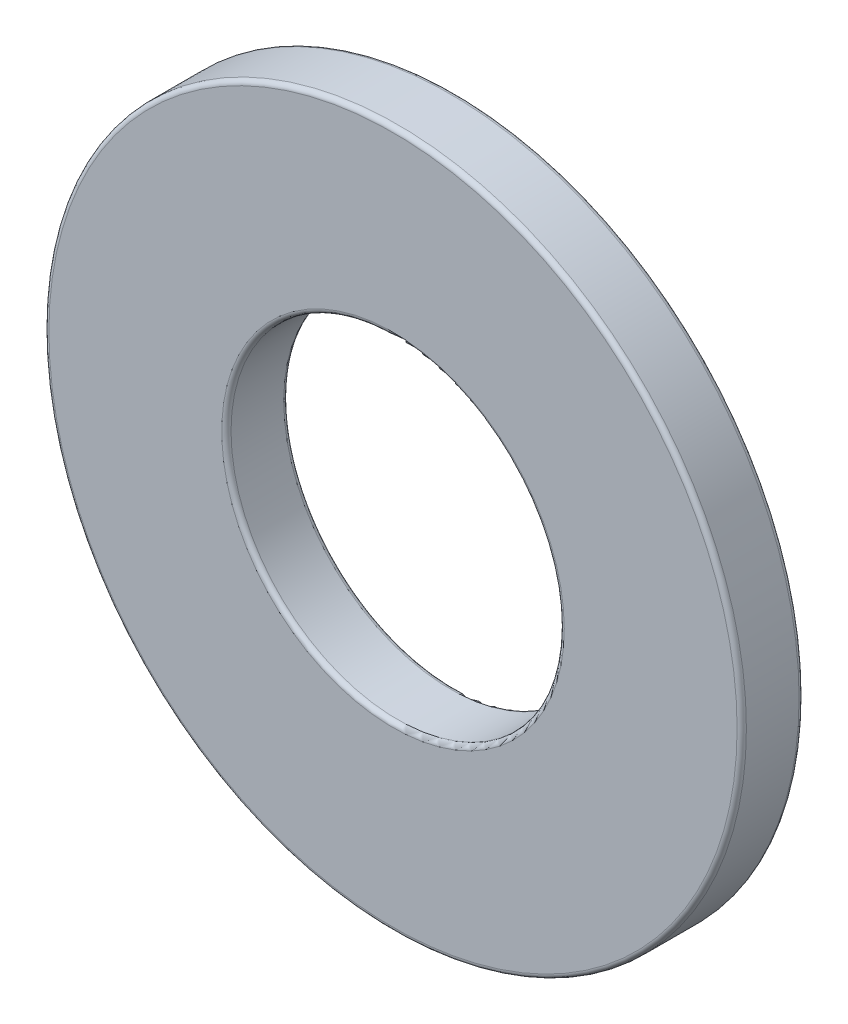
ISO-10303-21;
HEADER;
FILE_DESCRIPTION(('STEP AP214'),'2;1');
FILE_NAME('part.step','',(''),(''),'','','');
FILE_SCHEMA(('AUTOMOTIVE_DESIGN { 1 0 10303 214 1 1 1 1 }'));
ENDSEC;
DATA;
#1=APPLICATION_CONTEXT('core data for automotive mechanical design processes');
#2=APPLICATION_PROTOCOL_DEFINITION('international standard','automotive_design',2000,#1);
#3=PRODUCT_CONTEXT('',#1,'mechanical');
#4=PRODUCT('Part','Part','',(#3));
#5=PRODUCT_RELATED_PRODUCT_CATEGORY('part','',(#4));
#6=PRODUCT_DEFINITION_FORMATION('','',#4);
#7=PRODUCT_DEFINITION_CONTEXT('part definition',#1,'design');
#8=PRODUCT_DEFINITION('design','',#6,#7);
#9=PRODUCT_DEFINITION_SHAPE('','',#8);
#10=(LENGTH_UNIT() NAMED_UNIT(*) SI_UNIT(.MILLI.,.METRE.));
#11=(NAMED_UNIT(*) PLANE_ANGLE_UNIT() SI_UNIT($,.RADIAN.));
#12=(NAMED_UNIT(*) SI_UNIT($,.STERADIAN.) SOLID_ANGLE_UNIT());
#13=UNCERTAINTY_MEASURE_WITH_UNIT(LENGTH_MEASURE(1.E-05),#10,'distance_accuracy_value','');
#14=(GEOMETRIC_REPRESENTATION_CONTEXT(3) GLOBAL_UNCERTAINTY_ASSIGNED_CONTEXT((#13)) GLOBAL_UNIT_ASSIGNED_CONTEXT((#10,
#11,#12)) REPRESENTATION_CONTEXT('',''));
#15=CARTESIAN_POINT('',(0.,0.,0.));
#16=DIRECTION('',(0.,0.,1.));
#17=DIRECTION('',(1.,0.,0.));
#18=AXIS2_PLACEMENT_3D('',#15,#16,#17);
#19=CARTESIAN_POINT('',(0.,0.,-0.399999999999999));
#20=DIRECTION('',(0.,0.,1.));
#21=DIRECTION('',(1.,0.,0.));
#22=AXIS2_PLACEMENT_3D('',#19,#20,#21);
#23=CYLINDRICAL_SURFACE('',#22,4.5);
#24=CARTESIAN_POINT('',(0.,0.,0.340000000000001));
#25=DIRECTION('',(0.,0.,1.));
#26=DIRECTION('',(1.,0.,0.));
#27=AXIS2_PLACEMENT_3D('',#24,#25,#26);
#28=CIRCLE('',#27,4.5);
#29=CARTESIAN_POINT('',(4.5,0.,0.340000000000001));
#30=VERTEX_POINT('',#29);
#31=EDGE_CURVE('E65',#30,#30,#28,.F.);
#32=ORIENTED_EDGE('',*,*,#31,.T.);
#33=EDGE_LOOP('',(#32));
#34=FACE_BOUND('',#33,.T.);
#35=CARTESIAN_POINT('',(0.,0.,-0.339999999999999));
#36=DIRECTION('',(0.,0.,1.));
#37=DIRECTION('',(1.,0.,0.));
#38=AXIS2_PLACEMENT_3D('',#35,#36,#37);
#39=CIRCLE('',#38,4.5);
#40=CARTESIAN_POINT('',(4.5,0.,-0.339999999999999));
#41=VERTEX_POINT('',#40);
#42=EDGE_CURVE('E69',#41,#41,#39,.T.);
#43=ORIENTED_EDGE('',*,*,#42,.T.);
#44=EDGE_LOOP('',(#43));
#45=FACE_BOUND('',#44,.T.);
#46=ADVANCED_FACE('F39',(#34,#45),#23,.T.);
#47=CARTESIAN_POINT('',(0.,0.,-0.399999999999999));
#48=DIRECTION('',(0.,0.,1.));
#49=DIRECTION('',(1.,0.,0.));
#50=AXIS2_PLACEMENT_3D('',#47,#48,#49);
#51=PLANE('',#50);
#52=CARTESIAN_POINT('',(0.,0.,-0.399999999999999));
#53=DIRECTION('',(0.,0.,1.));
#54=DIRECTION('',(1.,0.,0.));
#55=AXIS2_PLACEMENT_3D('',#52,#53,#54);
#56=CIRCLE('',#55,4.44);
#57=CARTESIAN_POINT('',(4.44,0.,-0.399999999999999));
#58=VERTEX_POINT('',#57);
#59=EDGE_CURVE('E53',#58,#58,#56,.F.);
#60=ORIENTED_EDGE('',*,*,#59,.T.);
#61=EDGE_LOOP('',(#60));
#62=FACE_BOUND('',#61,.T.);
#63=CARTESIAN_POINT('',(0.,0.,-0.399999999999999));
#64=DIRECTION('',(0.,0.,1.));
#65=DIRECTION('',(1.,0.,0.));
#66=AXIS2_PLACEMENT_3D('',#63,#64,#65);
#67=CIRCLE('',#66,2.21);
#68=CARTESIAN_POINT('',(2.21,0.,-0.399999999999999));
#69=VERTEX_POINT('',#68);
#70=EDGE_CURVE('E59',#69,#69,#67,.T.);
#71=ORIENTED_EDGE('',*,*,#70,.T.);
#72=EDGE_LOOP('',(#71));
#73=FACE_BOUND('',#72,.T.);
#74=ADVANCED_FACE('F98',(#62,#73),#51,.F.);
#75=CARTESIAN_POINT('',(0.,0.,0.400000000000001));
#76=DIRECTION('',(0.,0.,1.));
#77=DIRECTION('',(1.,0.,0.));
#78=AXIS2_PLACEMENT_3D('',#75,#76,#77);
#79=PLANE('',#78);
#80=CARTESIAN_POINT('',(0.,0.,0.400000000000001));
#81=DIRECTION('',(0.,0.,1.));
#82=DIRECTION('',(1.,0.,0.));
#83=AXIS2_PLACEMENT_3D('',#80,#81,#82);
#84=CIRCLE('',#83,4.44);
#85=CARTESIAN_POINT('',(4.44,0.,0.400000000000001));
#86=VERTEX_POINT('',#85);
#87=EDGE_CURVE('E73',#86,#86,#84,.T.);
#88=ORIENTED_EDGE('',*,*,#87,.T.);
#89=EDGE_LOOP('',(#88));
#90=FACE_BOUND('',#89,.T.);
#91=CARTESIAN_POINT('',(0.,0.,0.400000000000001));
#92=DIRECTION('',(0.,0.,1.));
#93=DIRECTION('',(1.,0.,0.));
#94=AXIS2_PLACEMENT_3D('',#91,#92,#93);
#95=CIRCLE('',#94,2.21);
#96=CARTESIAN_POINT('',(2.21,0.,0.400000000000001));
#97=VERTEX_POINT('',#96);
#98=EDGE_CURVE('E77',#97,#97,#95,.F.);
#99=ORIENTED_EDGE('',*,*,#98,.T.);
#100=EDGE_LOOP('',(#99));
#101=FACE_BOUND('',#100,.T.);
#102=ADVANCED_FACE('F83',(#90,#101),#79,.T.);
#103=CARTESIAN_POINT('',(0.,0.,-0.399999999999999));
#104=DIRECTION('',(0.,0.,1.));
#105=DIRECTION('',(1.,0.,0.));
#106=AXIS2_PLACEMENT_3D('',#103,#104,#105);
#107=CYLINDRICAL_SURFACE('',#106,2.15);
#108=CARTESIAN_POINT('',(0.,0.,0.340000000000001));
#109=DIRECTION('',(0.,0.,1.));
#110=DIRECTION('',(1.,0.,0.));
#111=AXIS2_PLACEMENT_3D('',#108,#109,#110);
#112=CIRCLE('',#111,2.15);
#113=CARTESIAN_POINT('',(2.15,0.,0.340000000000001));
#114=VERTEX_POINT('',#113);
#115=EDGE_CURVE('E10',#114,#114,#112,.T.);
#116=ORIENTED_EDGE('',*,*,#115,.T.);
#117=EDGE_LOOP('',(#116));
#118=FACE_BOUND('',#117,.T.);
#119=CARTESIAN_POINT('',(0.,0.,-0.339999999999999));
#120=DIRECTION('',(0.,0.,1.));
#121=DIRECTION('',(1.,0.,0.));
#122=AXIS2_PLACEMENT_3D('',#119,#120,#121);
#123=CIRCLE('',#122,2.15);
#124=CARTESIAN_POINT('',(2.15,0.,-0.339999999999999));
#125=VERTEX_POINT('',#124);
#126=EDGE_CURVE('E47',#125,#125,#123,.F.);
#127=ORIENTED_EDGE('',*,*,#126,.T.);
#128=EDGE_LOOP('',(#127));
#129=FACE_BOUND('',#128,.T.);
#130=ADVANCED_FACE('F110',(#118,#129),#107,.F.);
#131=CARTESIAN_POINT('',(0.,0.,0.340000000000001));
#132=DIRECTION('',(0.,0.,1.));
#133=DIRECTION('',(1.,0.,0.));
#134=AXIS2_PLACEMENT_3D('',#131,#132,#133);
#135=TOROIDAL_SURFACE('',#134,4.44,0.06);
#136=ORIENTED_EDGE('',*,*,#31,.F.);
#137=EDGE_LOOP('',(#136));
#138=FACE_BOUND('',#137,.T.);
#139=ORIENTED_EDGE('',*,*,#87,.F.);
#140=EDGE_LOOP('',(#139));
#141=FACE_BOUND('',#140,.T.);
#142=ADVANCED_FACE('F94',(#138,#141),#135,.T.);
#143=CARTESIAN_POINT('',(0.,0.,-0.339999999999999));
#144=DIRECTION('',(0.,0.,1.));
#145=DIRECTION('',(1.,0.,0.));
#146=AXIS2_PLACEMENT_3D('',#143,#144,#145);
#147=TOROIDAL_SURFACE('',#146,4.44,0.06);
#148=ORIENTED_EDGE('',*,*,#59,.F.);
#149=EDGE_LOOP('',(#148));
#150=FACE_BOUND('',#149,.T.);
#151=ORIENTED_EDGE('',*,*,#42,.F.);
#152=EDGE_LOOP('',(#151));
#153=FACE_BOUND('',#152,.T.);
#154=ADVANCED_FACE('F88',(#150,#153),#147,.T.);
#155=CARTESIAN_POINT('',(0.,0.,0.340000000000001));
#156=DIRECTION('',(0.,0.,1.));
#157=DIRECTION('',(1.,0.,0.));
#158=AXIS2_PLACEMENT_3D('',#155,#156,#157);
#159=TOROIDAL_SURFACE('',#158,2.21,0.06);
#160=ORIENTED_EDGE('',*,*,#98,.F.);
#161=EDGE_LOOP('',(#160));
#162=FACE_BOUND('',#161,.T.);
#163=ORIENTED_EDGE('',*,*,#115,.F.);
#164=EDGE_LOOP('',(#163));
#165=FACE_BOUND('',#164,.T.);
#166=ADVANCED_FACE('F85',(#162,#165),#159,.T.);
#167=CARTESIAN_POINT('',(0.,0.,-0.339999999999999));
#168=DIRECTION('',(0.,0.,1.));
#169=DIRECTION('',(1.,0.,0.));
#170=AXIS2_PLACEMENT_3D('',#167,#168,#169);
#171=TOROIDAL_SURFACE('',#170,2.21,0.06);
#172=ORIENTED_EDGE('',*,*,#126,.F.);
#173=EDGE_LOOP('',(#172));
#174=FACE_BOUND('',#173,.T.);
#175=ORIENTED_EDGE('',*,*,#70,.F.);
#176=EDGE_LOOP('',(#175));
#177=FACE_BOUND('',#176,.T.);
#178=ADVANCED_FACE('F41',(#174,#177),#171,.T.);
#179=CLOSED_SHELL('',(#46,#74,#102,#130,#142,#154,#166,#178));
#180=MANIFOLD_SOLID_BREP('B2',#179);
#181=ADVANCED_BREP_SHAPE_REPRESENTATION('',(#18,#180),#14);
#182=SHAPE_DEFINITION_REPRESENTATION(#9,#181);
ENDSEC;
END-ISO-10303-21;
